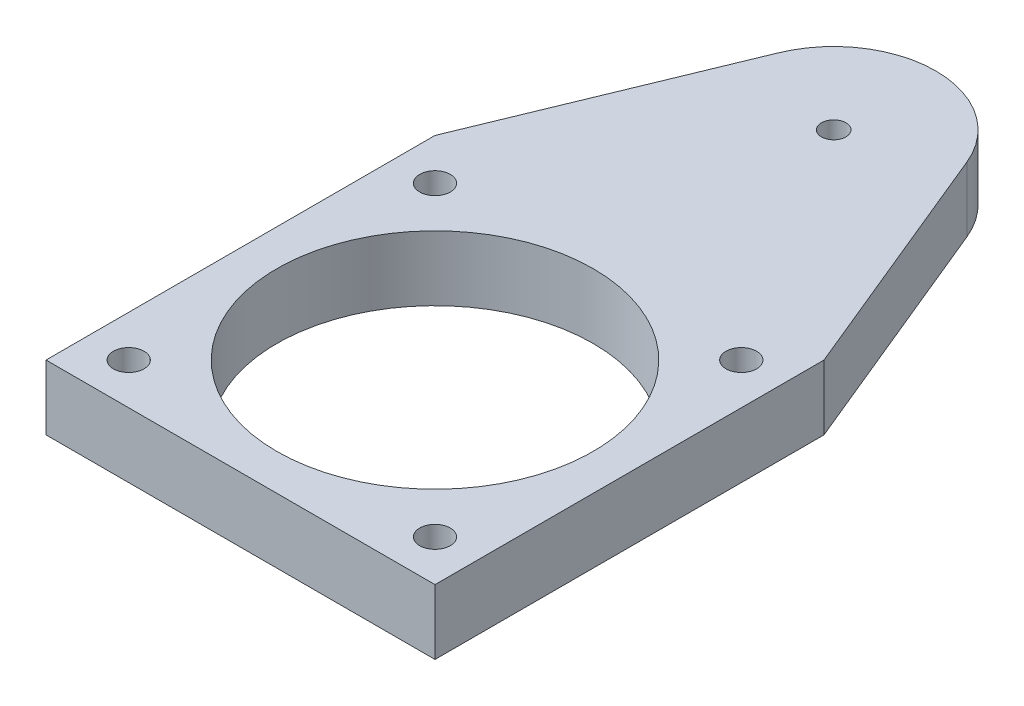
ISO-10303-21;
HEADER;
FILE_DESCRIPTION(('STEP AP214'),'2;1');
FILE_NAME('part.step','',(''),(''),'','','');
FILE_SCHEMA(('AUTOMOTIVE_DESIGN { 1 0 10303 214 1 1 1 1 }'));
ENDSEC;
DATA;
#1=APPLICATION_CONTEXT('core data for automotive mechanical design processes');
#2=APPLICATION_PROTOCOL_DEFINITION('international standard','automotive_design',2000,#1);
#3=PRODUCT_CONTEXT('',#1,'mechanical');
#4=PRODUCT('Part','Part','',(#3));
#5=PRODUCT_RELATED_PRODUCT_CATEGORY('part','',(#4));
#6=PRODUCT_DEFINITION_FORMATION('','',#4);
#7=PRODUCT_DEFINITION_CONTEXT('part definition',#1,'design');
#8=PRODUCT_DEFINITION('design','',#6,#7);
#9=PRODUCT_DEFINITION_SHAPE('','',#8);
#10=(LENGTH_UNIT() NAMED_UNIT(*) SI_UNIT(.MILLI.,.METRE.));
#11=(NAMED_UNIT(*) PLANE_ANGLE_UNIT() SI_UNIT($,.RADIAN.));
#12=(NAMED_UNIT(*) SI_UNIT($,.STERADIAN.) SOLID_ANGLE_UNIT());
#13=UNCERTAINTY_MEASURE_WITH_UNIT(LENGTH_MEASURE(1.E-05),#10,'distance_accuracy_value','');
#14=(GEOMETRIC_REPRESENTATION_CONTEXT(3) GLOBAL_UNCERTAINTY_ASSIGNED_CONTEXT((#13)) GLOBAL_UNIT_ASSIGNED_CONTEXT((#10,
#11,#12)) REPRESENTATION_CONTEXT('',''));
#15=CARTESIAN_POINT('',(0.,0.,0.));
#16=DIRECTION('',(0.,0.,1.));
#17=DIRECTION('',(1.,0.,0.));
#18=AXIS2_PLACEMENT_3D('',#15,#16,#17);
#19=CARTESIAN_POINT('',(19.05,6.35,-58.1));
#20=DIRECTION('',(0.,-1.,0.));
#21=DIRECTION('',(0.,0.,-1.));
#22=AXIS2_PLACEMENT_3D('',#19,#20,#21);
#23=PLANE('',#22);
#24=DIRECTION('',(0.,0.,1.));
#25=VECTOR('',#24,1.);
#26=CARTESIAN_POINT('',(0.,6.35,0.));
#27=LINE('',#26,#25);
#28=CARTESIAN_POINT('',(0.,6.35,-38.1));
#29=VERTEX_POINT('',#28);
#30=CARTESIAN_POINT('',(0.,6.35,0.));
#31=VERTEX_POINT('',#30);
#32=EDGE_CURVE('E146',#29,#31,#27,.T.);
#33=ORIENTED_EDGE('',*,*,#32,.T.);
#34=DIRECTION('',(1.,0.,0.));
#35=VECTOR('',#34,1.);
#36=CARTESIAN_POINT('',(0.,6.35,0.));
#37=LINE('',#36,#35);
#38=CARTESIAN_POINT('',(38.1,6.35,0.));
#39=VERTEX_POINT('',#38);
#40=EDGE_CURVE('E94',#31,#39,#37,.T.);
#41=ORIENTED_EDGE('',*,*,#40,.T.);
#42=DIRECTION('',(0.,0.,-1.));
#43=VECTOR('',#42,1.);
#44=CARTESIAN_POINT('',(38.1,6.35,0.));
#45=LINE('',#44,#43);
#46=CARTESIAN_POINT('',(38.1,6.35,-38.1));
#47=VERTEX_POINT('',#46);
#48=EDGE_CURVE('E107',#39,#47,#45,.T.);
#49=ORIENTED_EDGE('',*,*,#48,.T.);
#50=DIRECTION('',(-0.380754174960994,0.,-0.924676299171647));
#51=VECTOR('',#50,1.);
#52=CARTESIAN_POINT('',(28.2967629917165,6.35,-61.9075417496099));
#53=LINE('',#52,#51);
#54=CARTESIAN_POINT('',(28.2967629917165,6.35,-61.9075417496099));
#55=VERTEX_POINT('',#54);
#56=EDGE_CURVE('E101',#47,#55,#53,.T.);
#57=ORIENTED_EDGE('',*,*,#56,.T.);
#58=CARTESIAN_POINT('',(19.05,6.35,-58.1));
#59=DIRECTION('',(0.,1.,0.));
#60=DIRECTION('',(0.,0.,-1.));
#61=AXIS2_PLACEMENT_3D('',#58,#59,#60);
#62=CIRCLE('',#61,10.);
#63=CARTESIAN_POINT('',(9.80323700828353,6.35,-61.9075417496099));
#64=VERTEX_POINT('',#63);
#65=EDGE_CURVE('E105',#55,#64,#62,.T.);
#66=ORIENTED_EDGE('',*,*,#65,.T.);
#67=DIRECTION('',(-0.380754174960994,0.,0.924676299171647));
#68=VECTOR('',#67,1.);
#69=CARTESIAN_POINT('',(0.,6.35,-38.1));
#70=LINE('',#69,#68);
#71=EDGE_CURVE('E57',#64,#29,#70,.T.);
#72=ORIENTED_EDGE('',*,*,#71,.T.);
#73=EDGE_LOOP('',(#33,#41,#49,#57,#66,#72));
#74=FACE_BOUND('',#73,.T.);
#75=CARTESIAN_POINT('',(4.05000000000001,6.35,-4.04999999999999));
#76=DIRECTION('',(0.,1.,0.));
#77=DIRECTION('',(0.,0.,1.));
#78=AXIS2_PLACEMENT_3D('',#75,#76,#77);
#79=CIRCLE('',#78,1.5);
#80=CARTESIAN_POINT('',(4.05000000000001,6.35,-2.54999999999999));
#81=VERTEX_POINT('',#80);
#82=EDGE_CURVE('E134',#81,#81,#79,.T.);
#83=ORIENTED_EDGE('',*,*,#82,.F.);
#84=EDGE_LOOP('',(#83));
#85=FACE_BOUND('',#84,.T.);
#86=CARTESIAN_POINT('',(34.05,6.35,-4.04999999999999));
#87=DIRECTION('',(0.,1.,0.));
#88=DIRECTION('',(0.,0.,1.));
#89=AXIS2_PLACEMENT_3D('',#86,#87,#88);
#90=CIRCLE('',#89,1.5);
#91=CARTESIAN_POINT('',(34.05,6.35,-2.54999999999999));
#92=VERTEX_POINT('',#91);
#93=EDGE_CURVE('E242',#92,#92,#90,.T.);
#94=ORIENTED_EDGE('',*,*,#93,.F.);
#95=EDGE_LOOP('',(#94));
#96=FACE_BOUND('',#95,.T.);
#97=CARTESIAN_POINT('',(34.05,6.35,-34.05));
#98=DIRECTION('',(0.,1.,0.));
#99=DIRECTION('',(0.,0.,1.));
#100=AXIS2_PLACEMENT_3D('',#97,#98,#99);
#101=CIRCLE('',#100,1.5);
#102=CARTESIAN_POINT('',(34.05,6.35,-32.55));
#103=VERTEX_POINT('',#102);
#104=EDGE_CURVE('E234',#103,#103,#101,.T.);
#105=ORIENTED_EDGE('',*,*,#104,.F.);
#106=EDGE_LOOP('',(#105));
#107=FACE_BOUND('',#106,.T.);
#108=CARTESIAN_POINT('',(4.05,6.35,-34.05));
#109=DIRECTION('',(0.,1.,0.));
#110=DIRECTION('',(0.,0.,1.));
#111=AXIS2_PLACEMENT_3D('',#108,#109,#110);
#112=CIRCLE('',#111,1.5);
#113=CARTESIAN_POINT('',(4.05,6.35,-32.55));
#114=VERTEX_POINT('',#113);
#115=EDGE_CURVE('E226',#114,#114,#112,.T.);
#116=ORIENTED_EDGE('',*,*,#115,.F.);
#117=EDGE_LOOP('',(#116));
#118=FACE_BOUND('',#117,.T.);
#119=CARTESIAN_POINT('',(19.05,6.35,-19.05));
#120=DIRECTION('',(0.,1.,0.));
#121=DIRECTION('',(0.,0.,1.));
#122=AXIS2_PLACEMENT_3D('',#119,#120,#121);
#123=CIRCLE('',#122,15.5);
#124=CARTESIAN_POINT('',(19.05,6.35,-3.55));
#125=VERTEX_POINT('',#124);
#126=EDGE_CURVE('E218',#125,#125,#123,.T.);
#127=ORIENTED_EDGE('',*,*,#126,.F.);
#128=EDGE_LOOP('',(#127));
#129=FACE_BOUND('',#128,.T.);
#130=CARTESIAN_POINT('',(19.05,6.35,-58.1));
#131=DIRECTION('',(0.,1.,0.));
#132=DIRECTION('',(0.,0.,1.));
#133=AXIS2_PLACEMENT_3D('',#130,#131,#132);
#134=CIRCLE('',#133,1.2);
#135=CARTESIAN_POINT('',(19.05,6.35,-56.9));
#136=VERTEX_POINT('',#135);
#137=EDGE_CURVE('E207',#136,#136,#134,.T.);
#138=ORIENTED_EDGE('',*,*,#137,.F.);
#139=EDGE_LOOP('',(#138));
#140=FACE_BOUND('',#139,.T.);
#141=ADVANCED_FACE('F39',(#74,#85,#96,#107,#118,#129,#140),#23,.F.);
#142=CARTESIAN_POINT('',(19.05,0.,-58.1));
#143=DIRECTION('',(0.,-1.,0.));
#144=DIRECTION('',(0.,0.,-1.));
#145=AXIS2_PLACEMENT_3D('',#142,#143,#144);
#146=PLANE('',#145);
#147=CARTESIAN_POINT('',(19.05,0.,-19.05));
#148=DIRECTION('',(0.,1.,0.));
#149=DIRECTION('',(0.,0.,1.));
#150=AXIS2_PLACEMENT_3D('',#147,#148,#149);
#151=CIRCLE('',#150,15.5);
#152=CARTESIAN_POINT('',(19.05,0.,-3.55));
#153=VERTEX_POINT('',#152);
#154=EDGE_CURVE('E215',#153,#153,#151,.T.);
#155=ORIENTED_EDGE('',*,*,#154,.T.);
#156=EDGE_LOOP('',(#155));
#157=FACE_BOUND('',#156,.T.);
#158=CARTESIAN_POINT('',(34.05,0.,-34.05));
#159=DIRECTION('',(0.,1.,0.));
#160=DIRECTION('',(0.,0.,1.));
#161=AXIS2_PLACEMENT_3D('',#158,#159,#160);
#162=CIRCLE('',#161,1.5);
#163=CARTESIAN_POINT('',(34.05,0.,-32.55));
#164=VERTEX_POINT('',#163);
#165=EDGE_CURVE('E230',#164,#164,#162,.T.);
#166=ORIENTED_EDGE('',*,*,#165,.T.);
#167=EDGE_LOOP('',(#166));
#168=FACE_BOUND('',#167,.T.);
#169=CARTESIAN_POINT('',(4.05000000000001,0.,-4.04999999999999));
#170=DIRECTION('',(0.,1.,0.));
#171=DIRECTION('',(0.,0.,1.));
#172=AXIS2_PLACEMENT_3D('',#169,#170,#171);
#173=CIRCLE('',#172,1.5);
#174=CARTESIAN_POINT('',(4.05000000000001,0.,-2.54999999999999));
#175=VERTEX_POINT('',#174);
#176=EDGE_CURVE('E246',#175,#175,#173,.T.);
#177=ORIENTED_EDGE('',*,*,#176,.T.);
#178=EDGE_LOOP('',(#177));
#179=FACE_BOUND('',#178,.T.);
#180=DIRECTION('',(0.,0.,1.));
#181=VECTOR('',#180,1.);
#182=CARTESIAN_POINT('',(0.,0.,0.));
#183=LINE('',#182,#181);
#184=CARTESIAN_POINT('',(0.,0.,-38.1));
#185=VERTEX_POINT('',#184);
#186=CARTESIAN_POINT('',(0.,0.,0.));
#187=VERTEX_POINT('',#186);
#188=EDGE_CURVE('E129',#185,#187,#183,.T.);
#189=ORIENTED_EDGE('',*,*,#188,.F.);
#190=DIRECTION('',(-0.380754174960994,0.,0.924676299171647));
#191=VECTOR('',#190,1.);
#192=CARTESIAN_POINT('',(0.,0.,-38.1));
#193=LINE('',#192,#191);
#194=CARTESIAN_POINT('',(9.80323700828353,0.,-61.9075417496099));
#195=VERTEX_POINT('',#194);
#196=EDGE_CURVE('E86',#195,#185,#193,.T.);
#197=ORIENTED_EDGE('',*,*,#196,.F.);
#198=CARTESIAN_POINT('',(19.05,0.,-58.1));
#199=DIRECTION('',(0.,1.,0.));
#200=DIRECTION('',(0.,0.,-1.));
#201=AXIS2_PLACEMENT_3D('',#198,#199,#200);
#202=CIRCLE('',#201,10.);
#203=CARTESIAN_POINT('',(28.2967629917165,0.,-61.9075417496099));
#204=VERTEX_POINT('',#203);
#205=EDGE_CURVE('E80',#204,#195,#202,.T.);
#206=ORIENTED_EDGE('',*,*,#205,.F.);
#207=DIRECTION('',(-0.380754174960994,0.,-0.924676299171647));
#208=VECTOR('',#207,1.);
#209=CARTESIAN_POINT('',(28.2967629917165,0.,-61.9075417496099));
#210=LINE('',#209,#208);
#211=CARTESIAN_POINT('',(38.1,0.,-38.1));
#212=VERTEX_POINT('',#211);
#213=EDGE_CURVE('E116',#212,#204,#210,.T.);
#214=ORIENTED_EDGE('',*,*,#213,.F.);
#215=DIRECTION('',(0.,0.,-1.));
#216=VECTOR('',#215,1.);
#217=CARTESIAN_POINT('',(38.1,0.,0.));
#218=LINE('',#217,#216);
#219=CARTESIAN_POINT('',(38.1,0.,0.));
#220=VERTEX_POINT('',#219);
#221=EDGE_CURVE('E137',#220,#212,#218,.T.);
#222=ORIENTED_EDGE('',*,*,#221,.F.);
#223=DIRECTION('',(1.,0.,0.));
#224=VECTOR('',#223,1.);
#225=CARTESIAN_POINT('',(0.,0.,0.));
#226=LINE('',#225,#224);
#227=EDGE_CURVE('E133',#187,#220,#226,.T.);
#228=ORIENTED_EDGE('',*,*,#227,.F.);
#229=EDGE_LOOP('',(#189,#197,#206,#214,#222,#228));
#230=FACE_BOUND('',#229,.T.);
#231=CARTESIAN_POINT('',(34.05,0.,-4.04999999999999));
#232=DIRECTION('',(0.,1.,0.));
#233=DIRECTION('',(0.,0.,1.));
#234=AXIS2_PLACEMENT_3D('',#231,#232,#233);
#235=CIRCLE('',#234,1.5);
#236=CARTESIAN_POINT('',(34.05,0.,-2.54999999999999));
#237=VERTEX_POINT('',#236);
#238=EDGE_CURVE('E238',#237,#237,#235,.T.);
#239=ORIENTED_EDGE('',*,*,#238,.T.);
#240=EDGE_LOOP('',(#239));
#241=FACE_BOUND('',#240,.T.);
#242=CARTESIAN_POINT('',(4.05,0.,-34.05));
#243=DIRECTION('',(0.,1.,0.));
#244=DIRECTION('',(0.,0.,1.));
#245=AXIS2_PLACEMENT_3D('',#242,#243,#244);
#246=CIRCLE('',#245,1.5);
#247=CARTESIAN_POINT('',(4.05,0.,-32.55));
#248=VERTEX_POINT('',#247);
#249=EDGE_CURVE('E222',#248,#248,#246,.T.);
#250=ORIENTED_EDGE('',*,*,#249,.T.);
#251=EDGE_LOOP('',(#250));
#252=FACE_BOUND('',#251,.T.);
#253=CARTESIAN_POINT('',(19.05,0.,-58.1));
#254=DIRECTION('',(0.,1.,0.));
#255=DIRECTION('',(0.,0.,1.));
#256=AXIS2_PLACEMENT_3D('',#253,#254,#255);
#257=CIRCLE('',#256,1.2);
#258=CARTESIAN_POINT('',(19.05,0.,-56.9));
#259=VERTEX_POINT('',#258);
#260=EDGE_CURVE('E210',#259,#259,#257,.T.);
#261=ORIENTED_EDGE('',*,*,#260,.T.);
#262=EDGE_LOOP('',(#261));
#263=FACE_BOUND('',#262,.T.);
#264=ADVANCED_FACE('F159',(#157,#168,#179,#230,#241,#252,#263),#146,.T.);
#265=CARTESIAN_POINT('',(0.,6.35,0.));
#266=DIRECTION('',(1.,0.,0.));
#267=DIRECTION('',(0.,0.,-1.));
#268=AXIS2_PLACEMENT_3D('',#265,#266,#267);
#269=PLANE('',#268);
#270=ORIENTED_EDGE('',*,*,#188,.T.);
#271=DIRECTION('',(0.,-1.,0.));
#272=VECTOR('',#271,1.);
#273=CARTESIAN_POINT('',(0.,6.35,0.));
#274=LINE('',#273,#272);
#275=EDGE_CURVE('E11',#31,#187,#274,.T.);
#276=ORIENTED_EDGE('',*,*,#275,.F.);
#277=ORIENTED_EDGE('',*,*,#32,.F.);
#278=DIRECTION('',(0.,-1.,0.));
#279=VECTOR('',#278,1.);
#280=CARTESIAN_POINT('',(0.,6.35,-38.1));
#281=LINE('',#280,#279);
#282=EDGE_CURVE('E125',#29,#185,#281,.T.);
#283=ORIENTED_EDGE('',*,*,#282,.T.);
#284=EDGE_LOOP('',(#270,#276,#277,#283));
#285=FACE_BOUND('',#284,.T.);
#286=ADVANCED_FACE('F41',(#285),#269,.F.);
#287=CARTESIAN_POINT('',(0.,6.35,0.));
#288=DIRECTION('',(0.,0.,-1.));
#289=DIRECTION('',(-1.,0.,0.));
#290=AXIS2_PLACEMENT_3D('',#287,#288,#289);
#291=PLANE('',#290);
#292=ORIENTED_EDGE('',*,*,#227,.T.);
#293=DIRECTION('',(0.,-1.,0.));
#294=VECTOR('',#293,1.);
#295=CARTESIAN_POINT('',(38.1,6.35,0.));
#296=LINE('',#295,#294);
#297=EDGE_CURVE('E49',#39,#220,#296,.T.);
#298=ORIENTED_EDGE('',*,*,#297,.F.);
#299=ORIENTED_EDGE('',*,*,#40,.F.);
#300=ORIENTED_EDGE('',*,*,#275,.T.);
#301=EDGE_LOOP('',(#292,#298,#299,#300));
#302=FACE_BOUND('',#301,.T.);
#303=ADVANCED_FACE('F330',(#302),#291,.F.);
#304=CARTESIAN_POINT('',(38.1,6.35,0.));
#305=DIRECTION('',(-1.,0.,0.));
#306=DIRECTION('',(0.,0.,1.));
#307=AXIS2_PLACEMENT_3D('',#304,#305,#306);
#308=PLANE('',#307);
#309=ORIENTED_EDGE('',*,*,#221,.T.);
#310=DIRECTION('',(0.,-1.,0.));
#311=VECTOR('',#310,1.);
#312=CARTESIAN_POINT('',(38.1,6.35,-38.1));
#313=LINE('',#312,#311);
#314=EDGE_CURVE('E118',#47,#212,#313,.T.);
#315=ORIENTED_EDGE('',*,*,#314,.F.);
#316=ORIENTED_EDGE('',*,*,#48,.F.);
#317=ORIENTED_EDGE('',*,*,#297,.T.);
#318=EDGE_LOOP('',(#309,#315,#316,#317));
#319=FACE_BOUND('',#318,.T.);
#320=ADVANCED_FACE('F156',(#319),#308,.F.);
#321=CARTESIAN_POINT('',(28.2967629917165,6.35,-61.9075417496099));
#322=DIRECTION('',(-0.924676299171647,0.,0.380754174960993));
#323=DIRECTION('',(0.380754174960993,0.,0.924676299171647));
#324=AXIS2_PLACEMENT_3D('',#321,#322,#323);
#325=PLANE('',#324);
#326=ORIENTED_EDGE('',*,*,#213,.T.);
#327=DIRECTION('',(0.,-1.,0.));
#328=VECTOR('',#327,1.);
#329=CARTESIAN_POINT('',(28.2967629917165,6.35,-61.9075417496099));
#330=LINE('',#329,#328);
#331=EDGE_CURVE('E113',#55,#204,#330,.T.);
#332=ORIENTED_EDGE('',*,*,#331,.F.);
#333=ORIENTED_EDGE('',*,*,#56,.F.);
#334=ORIENTED_EDGE('',*,*,#314,.T.);
#335=EDGE_LOOP('',(#326,#332,#333,#334));
#336=FACE_BOUND('',#335,.T.);
#337=ADVANCED_FACE('F114',(#336),#325,.F.);
#338=CARTESIAN_POINT('',(19.05,6.35,-58.1));
#339=DIRECTION('',(0.,-1.,0.));
#340=DIRECTION('',(0.,0.,-1.));
#341=AXIS2_PLACEMENT_3D('',#338,#339,#340);
#342=CYLINDRICAL_SURFACE('',#341,10.);
#343=ORIENTED_EDGE('',*,*,#205,.T.);
#344=DIRECTION('',(0.,-1.,0.));
#345=VECTOR('',#344,1.);
#346=CARTESIAN_POINT('',(9.80323700828353,6.35,-61.9075417496099));
#347=LINE('',#346,#345);
#348=EDGE_CURVE('E119',#64,#195,#347,.T.);
#349=ORIENTED_EDGE('',*,*,#348,.F.);
#350=ORIENTED_EDGE('',*,*,#65,.F.);
#351=ORIENTED_EDGE('',*,*,#331,.T.);
#352=EDGE_LOOP('',(#343,#349,#350,#351));
#353=FACE_BOUND('',#352,.T.);
#354=ADVANCED_FACE('F121',(#353),#342,.T.);
#355=CARTESIAN_POINT('',(0.,6.35,-38.1));
#356=DIRECTION('',(0.924676299171647,0.,0.380754174960994));
#357=DIRECTION('',(0.380754174960994,0.,-0.924676299171647));
#358=AXIS2_PLACEMENT_3D('',#355,#356,#357);
#359=PLANE('',#358);
#360=ORIENTED_EDGE('',*,*,#196,.T.);
#361=ORIENTED_EDGE('',*,*,#282,.F.);
#362=ORIENTED_EDGE('',*,*,#71,.F.);
#363=ORIENTED_EDGE('',*,*,#348,.T.);
#364=EDGE_LOOP('',(#360,#361,#362,#363));
#365=FACE_BOUND('',#364,.T.);
#366=ADVANCED_FACE('F164',(#365),#359,.F.);
#367=CARTESIAN_POINT('',(4.05000000000001,6.35,-4.04999999999999));
#368=DIRECTION('',(0.,-1.,0.));
#369=DIRECTION('',(0.,0.,-1.));
#370=AXIS2_PLACEMENT_3D('',#367,#368,#369);
#371=CYLINDRICAL_SURFACE('',#370,1.5);
#372=ORIENTED_EDGE('',*,*,#82,.T.);
#373=EDGE_LOOP('',(#372));
#374=FACE_BOUND('',#373,.T.);
#375=ORIENTED_EDGE('',*,*,#176,.F.);
#376=EDGE_LOOP('',(#375));
#377=FACE_BOUND('',#376,.T.);
#378=ADVANCED_FACE('F166',(#374,#377),#371,.F.);
#379=CARTESIAN_POINT('',(34.05,6.35,-4.04999999999999));
#380=DIRECTION('',(0.,-1.,0.));
#381=DIRECTION('',(0.,0.,-1.));
#382=AXIS2_PLACEMENT_3D('',#379,#380,#381);
#383=CYLINDRICAL_SURFACE('',#382,1.5);
#384=ORIENTED_EDGE('',*,*,#93,.T.);
#385=EDGE_LOOP('',(#384));
#386=FACE_BOUND('',#385,.T.);
#387=ORIENTED_EDGE('',*,*,#238,.F.);
#388=EDGE_LOOP('',(#387));
#389=FACE_BOUND('',#388,.T.);
#390=ADVANCED_FACE('F172',(#386,#389),#383,.F.);
#391=CARTESIAN_POINT('',(34.05,6.35,-34.05));
#392=DIRECTION('',(0.,-1.,0.));
#393=DIRECTION('',(0.,0.,-1.));
#394=AXIS2_PLACEMENT_3D('',#391,#392,#393);
#395=CYLINDRICAL_SURFACE('',#394,1.5);
#396=ORIENTED_EDGE('',*,*,#104,.T.);
#397=EDGE_LOOP('',(#396));
#398=FACE_BOUND('',#397,.T.);
#399=ORIENTED_EDGE('',*,*,#165,.F.);
#400=EDGE_LOOP('',(#399));
#401=FACE_BOUND('',#400,.T.);
#402=ADVANCED_FACE('F186',(#398,#401),#395,.F.);
#403=CARTESIAN_POINT('',(4.05,6.35,-34.05));
#404=DIRECTION('',(0.,-1.,0.));
#405=DIRECTION('',(0.,0.,-1.));
#406=AXIS2_PLACEMENT_3D('',#403,#404,#405);
#407=CYLINDRICAL_SURFACE('',#406,1.5);
#408=ORIENTED_EDGE('',*,*,#115,.T.);
#409=EDGE_LOOP('',(#408));
#410=FACE_BOUND('',#409,.T.);
#411=ORIENTED_EDGE('',*,*,#249,.F.);
#412=EDGE_LOOP('',(#411));
#413=FACE_BOUND('',#412,.T.);
#414=ADVANCED_FACE('F190',(#410,#413),#407,.F.);
#415=CARTESIAN_POINT('',(19.05,6.35,-19.05));
#416=DIRECTION('',(0.,-1.,0.));
#417=DIRECTION('',(0.,0.,-1.));
#418=AXIS2_PLACEMENT_3D('',#415,#416,#417);
#419=CYLINDRICAL_SURFACE('',#418,15.5);
#420=ORIENTED_EDGE('',*,*,#126,.T.);
#421=EDGE_LOOP('',(#420));
#422=FACE_BOUND('',#421,.T.);
#423=ORIENTED_EDGE('',*,*,#154,.F.);
#424=EDGE_LOOP('',(#423));
#425=FACE_BOUND('',#424,.T.);
#426=ADVANCED_FACE('F194',(#422,#425),#419,.F.);
#427=CARTESIAN_POINT('',(19.05,6.35,-58.1));
#428=DIRECTION('',(0.,-1.,0.));
#429=DIRECTION('',(0.,0.,-1.));
#430=AXIS2_PLACEMENT_3D('',#427,#428,#429);
#431=CYLINDRICAL_SURFACE('',#430,1.2);
#432=ORIENTED_EDGE('',*,*,#137,.T.);
#433=EDGE_LOOP('',(#432));
#434=FACE_BOUND('',#433,.T.);
#435=ORIENTED_EDGE('',*,*,#260,.F.);
#436=EDGE_LOOP('',(#435));
#437=FACE_BOUND('',#436,.T.);
#438=ADVANCED_FACE('F198',(#434,#437),#431,.F.);
#439=CLOSED_SHELL('',(#141,#264,#286,#303,#320,#337,#354,#366,#378,#390,#402,#414,#426,#438));
#440=MANIFOLD_SOLID_BREP('B2',#439);
#441=ADVANCED_BREP_SHAPE_REPRESENTATION('',(#18,#440),#14);
#442=SHAPE_DEFINITION_REPRESENTATION(#9,#441);
ENDSEC;
END-ISO-10303-21;
